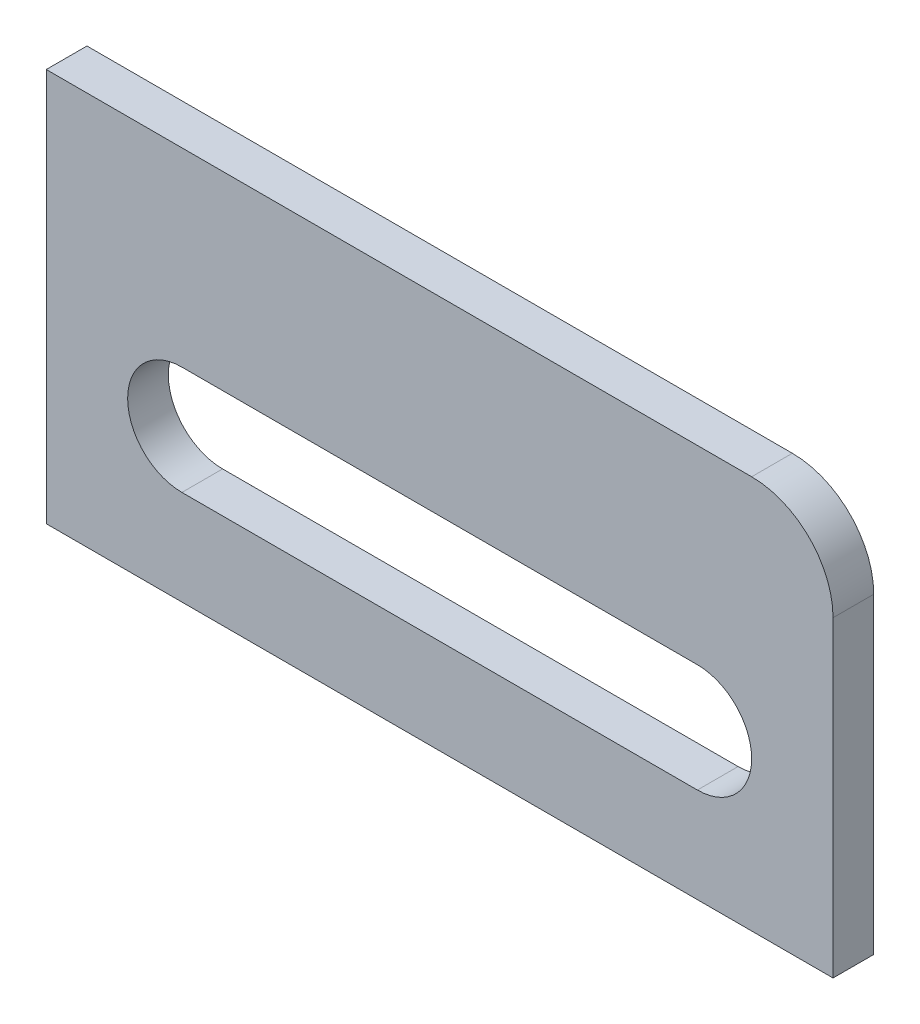
ISO-10303-21;
HEADER;
FILE_DESCRIPTION(('STEP AP214'),'2;1');
FILE_NAME('part.step','',(''),(''),'','','');
FILE_SCHEMA(('AUTOMOTIVE_DESIGN { 1 0 10303 214 1 1 1 1 }'));
ENDSEC;
DATA;
#1=APPLICATION_CONTEXT('core data for automotive mechanical design processes');
#2=APPLICATION_PROTOCOL_DEFINITION('international standard','automotive_design',2000,#1);
#3=PRODUCT_CONTEXT('',#1,'mechanical');
#4=PRODUCT('Part','Part','',(#3));
#5=PRODUCT_RELATED_PRODUCT_CATEGORY('part','',(#4));
#6=PRODUCT_DEFINITION_FORMATION('','',#4);
#7=PRODUCT_DEFINITION_CONTEXT('part definition',#1,'design');
#8=PRODUCT_DEFINITION('design','',#6,#7);
#9=PRODUCT_DEFINITION_SHAPE('','',#8);
#10=(LENGTH_UNIT() NAMED_UNIT(*) SI_UNIT(.MILLI.,.METRE.));
#11=(NAMED_UNIT(*) PLANE_ANGLE_UNIT() SI_UNIT($,.RADIAN.));
#12=(NAMED_UNIT(*) SI_UNIT($,.STERADIAN.) SOLID_ANGLE_UNIT());
#13=UNCERTAINTY_MEASURE_WITH_UNIT(LENGTH_MEASURE(1.E-05),#10,'distance_accuracy_value','');
#14=(GEOMETRIC_REPRESENTATION_CONTEXT(3) GLOBAL_UNCERTAINTY_ASSIGNED_CONTEXT((#13)) GLOBAL_UNIT_ASSIGNED_CONTEXT((#10,
#11,#12)) REPRESENTATION_CONTEXT('',''));
#15=CARTESIAN_POINT('',(0.,0.,0.));
#16=DIRECTION('',(0.,0.,1.));
#17=DIRECTION('',(1.,0.,0.));
#18=AXIS2_PLACEMENT_3D('',#15,#16,#17);
#19=CARTESIAN_POINT('',(0.,0.,3.));
#20=DIRECTION('',(0.,1.,0.));
#21=DIRECTION('',(0.,0.,1.));
#22=AXIS2_PLACEMENT_3D('',#19,#20,#21);
#23=PLANE('',#22);
#24=DIRECTION('',(1.,0.,0.));
#25=VECTOR('',#24,1.);
#26=CARTESIAN_POINT('',(0.,0.,0.));
#27=LINE('',#26,#25);
#28=CARTESIAN_POINT('',(0.,0.,0.));
#29=VERTEX_POINT('',#28);
#30=CARTESIAN_POINT('',(58.,0.,0.));
#31=VERTEX_POINT('',#30);
#32=EDGE_CURVE('E129',#29,#31,#27,.T.);
#33=ORIENTED_EDGE('',*,*,#32,.T.);
#34=DIRECTION('',(0.,0.,-1.));
#35=VECTOR('',#34,1.);
#36=CARTESIAN_POINT('',(58.,0.,3.));
#37=LINE('',#36,#35);
#38=CARTESIAN_POINT('',(58.,0.,3.));
#39=VERTEX_POINT('',#38);
#40=EDGE_CURVE('E165',#39,#31,#37,.T.);
#41=ORIENTED_EDGE('',*,*,#40,.F.);
#42=DIRECTION('',(1.,0.,0.));
#43=VECTOR('',#42,1.);
#44=CARTESIAN_POINT('',(0.,0.,3.));
#45=LINE('',#44,#43);
#46=CARTESIAN_POINT('',(0.,0.,3.));
#47=VERTEX_POINT('',#46);
#48=EDGE_CURVE('E132',#47,#39,#45,.T.);
#49=ORIENTED_EDGE('',*,*,#48,.F.);
#50=DIRECTION('',(0.,0.,-1.));
#51=VECTOR('',#50,1.);
#52=CARTESIAN_POINT('',(0.,0.,3.));
#53=LINE('',#52,#51);
#54=EDGE_CURVE('E144',#47,#29,#53,.T.);
#55=ORIENTED_EDGE('',*,*,#54,.T.);
#56=EDGE_LOOP('',(#33,#41,#49,#55));
#57=FACE_BOUND('',#56,.T.);
#58=ADVANCED_FACE('F34',(#57),#23,.F.);
#59=CARTESIAN_POINT('',(58.,0.,3.));
#60=DIRECTION('',(-1.,0.,0.));
#61=DIRECTION('',(0.,-1.,0.));
#62=AXIS2_PLACEMENT_3D('',#59,#60,#61);
#63=PLANE('',#62);
#64=DIRECTION('',(0.,1.,0.));
#65=VECTOR('',#64,1.);
#66=CARTESIAN_POINT('',(58.,0.,0.));
#67=LINE('',#66,#65);
#68=CARTESIAN_POINT('',(58.,23.,0.));
#69=VERTEX_POINT('',#68);
#70=EDGE_CURVE('E147',#31,#69,#67,.T.);
#71=ORIENTED_EDGE('',*,*,#70,.T.);
#72=DIRECTION('',(0.,0.,-1.));
#73=VECTOR('',#72,1.);
#74=CARTESIAN_POINT('',(58.,23.,3.));
#75=LINE('',#74,#73);
#76=CARTESIAN_POINT('',(58.,23.,3.));
#77=VERTEX_POINT('',#76);
#78=EDGE_CURVE('E162',#77,#69,#75,.T.);
#79=ORIENTED_EDGE('',*,*,#78,.F.);
#80=DIRECTION('',(0.,1.,0.));
#81=VECTOR('',#80,1.);
#82=CARTESIAN_POINT('',(58.,0.,3.));
#83=LINE('',#82,#81);
#84=EDGE_CURVE('E135',#39,#77,#83,.T.);
#85=ORIENTED_EDGE('',*,*,#84,.F.);
#86=ORIENTED_EDGE('',*,*,#40,.T.);
#87=EDGE_LOOP('',(#71,#79,#85,#86));
#88=FACE_BOUND('',#87,.T.);
#89=ADVANCED_FACE('F190',(#88),#63,.F.);
#90=CARTESIAN_POINT('',(52.,23.,3.));
#91=DIRECTION('',(0.,0.,-1.));
#92=DIRECTION('',(-1.,0.,0.));
#93=AXIS2_PLACEMENT_3D('',#90,#91,#92);
#94=CYLINDRICAL_SURFACE('',#93,6.);
#95=CARTESIAN_POINT('',(52.,23.,0.));
#96=DIRECTION('',(0.,0.,1.));
#97=DIRECTION('',(-1.,0.,0.));
#98=AXIS2_PLACEMENT_3D('',#95,#96,#97);
#99=CIRCLE('',#98,6.);
#100=CARTESIAN_POINT('',(51.9999999999999,29.,0.));
#101=VERTEX_POINT('',#100);
#102=EDGE_CURVE('E149',#69,#101,#99,.T.);
#103=ORIENTED_EDGE('',*,*,#102,.T.);
#104=DIRECTION('',(0.,0.,-1.));
#105=VECTOR('',#104,1.);
#106=CARTESIAN_POINT('',(51.9999999999999,29.,3.));
#107=LINE('',#106,#105);
#108=CARTESIAN_POINT('',(51.9999999999999,29.,3.));
#109=VERTEX_POINT('',#108);
#110=EDGE_CURVE('E159',#109,#101,#107,.T.);
#111=ORIENTED_EDGE('',*,*,#110,.F.);
#112=CARTESIAN_POINT('',(52.,23.,3.));
#113=DIRECTION('',(0.,0.,1.));
#114=DIRECTION('',(-1.,0.,0.));
#115=AXIS2_PLACEMENT_3D('',#112,#113,#114);
#116=CIRCLE('',#115,6.);
#117=EDGE_CURVE('E138',#77,#109,#116,.T.);
#118=ORIENTED_EDGE('',*,*,#117,.F.);
#119=ORIENTED_EDGE('',*,*,#78,.T.);
#120=EDGE_LOOP('',(#103,#111,#118,#119));
#121=FACE_BOUND('',#120,.T.);
#122=ADVANCED_FACE('F195',(#121),#94,.T.);
#123=CARTESIAN_POINT('',(0.,29.,3.));
#124=DIRECTION('',(0.,-1.,0.));
#125=DIRECTION('',(0.,0.,-1.));
#126=AXIS2_PLACEMENT_3D('',#123,#124,#125);
#127=PLANE('',#126);
#128=DIRECTION('',(-1.,0.,0.));
#129=VECTOR('',#128,1.);
#130=CARTESIAN_POINT('',(0.,29.,0.));
#131=LINE('',#130,#129);
#132=CARTESIAN_POINT('',(0.,29.,0.));
#133=VERTEX_POINT('',#132);
#134=EDGE_CURVE('E151',#101,#133,#131,.T.);
#135=ORIENTED_EDGE('',*,*,#134,.T.);
#136=DIRECTION('',(0.,0.,-1.));
#137=VECTOR('',#136,1.);
#138=CARTESIAN_POINT('',(0.,29.,3.));
#139=LINE('',#138,#137);
#140=CARTESIAN_POINT('',(0.,29.,3.));
#141=VERTEX_POINT('',#140);
#142=EDGE_CURVE('E156',#141,#133,#139,.T.);
#143=ORIENTED_EDGE('',*,*,#142,.F.);
#144=DIRECTION('',(-1.,0.,0.));
#145=VECTOR('',#144,1.);
#146=CARTESIAN_POINT('',(0.,29.,3.));
#147=LINE('',#146,#145);
#148=EDGE_CURVE('E140',#109,#141,#147,.T.);
#149=ORIENTED_EDGE('',*,*,#148,.F.);
#150=ORIENTED_EDGE('',*,*,#110,.T.);
#151=EDGE_LOOP('',(#135,#143,#149,#150));
#152=FACE_BOUND('',#151,.T.);
#153=ADVANCED_FACE('F212',(#152),#127,.F.);
#154=CARTESIAN_POINT('',(0.,29.,3.));
#155=DIRECTION('',(1.,0.,0.));
#156=DIRECTION('',(0.,0.,-1.));
#157=AXIS2_PLACEMENT_3D('',#154,#155,#156);
#158=PLANE('',#157);
#159=DIRECTION('',(0.,-1.,0.));
#160=VECTOR('',#159,1.);
#161=CARTESIAN_POINT('',(0.,29.,0.));
#162=LINE('',#161,#160);
#163=EDGE_CURVE('E136',#133,#29,#162,.T.);
#164=ORIENTED_EDGE('',*,*,#163,.T.);
#165=ORIENTED_EDGE('',*,*,#54,.F.);
#166=DIRECTION('',(0.,-1.,0.));
#167=VECTOR('',#166,1.);
#168=CARTESIAN_POINT('',(0.,29.,3.));
#169=LINE('',#168,#167);
#170=EDGE_CURVE('E142',#141,#47,#169,.T.);
#171=ORIENTED_EDGE('',*,*,#170,.F.);
#172=ORIENTED_EDGE('',*,*,#142,.T.);
#173=EDGE_LOOP('',(#164,#165,#171,#172));
#174=FACE_BOUND('',#173,.T.);
#175=ADVANCED_FACE('F210',(#174),#158,.F.);
#176=CARTESIAN_POINT('',(52.,23.,3.));
#177=DIRECTION('',(0.,0.,-1.));
#178=DIRECTION('',(-1.,0.,0.));
#179=AXIS2_PLACEMENT_3D('',#176,#177,#178);
#180=PLANE('',#179);
#181=DIRECTION('',(1.,0.,0.));
#182=VECTOR('',#181,1.);
#183=CARTESIAN_POINT('',(10.,7.,3.));
#184=LINE('',#183,#182);
#185=CARTESIAN_POINT('',(10.,7.,3.));
#186=VERTEX_POINT('',#185);
#187=CARTESIAN_POINT('',(48.,7.,3.));
#188=VERTEX_POINT('',#187);
#189=EDGE_CURVE('E115',#186,#188,#184,.T.);
#190=ORIENTED_EDGE('',*,*,#189,.F.);
#191=CARTESIAN_POINT('',(10.,11.,3.));
#192=DIRECTION('',(0.,0.,1.));
#193=DIRECTION('',(1.,0.,0.));
#194=AXIS2_PLACEMENT_3D('',#191,#192,#193);
#195=CIRCLE('',#194,4.);
#196=CARTESIAN_POINT('',(10.,15.,3.));
#197=VERTEX_POINT('',#196);
#198=EDGE_CURVE('E48',#197,#186,#195,.T.);
#199=ORIENTED_EDGE('',*,*,#198,.F.);
#200=DIRECTION('',(-1.,0.,0.));
#201=VECTOR('',#200,1.);
#202=CARTESIAN_POINT('',(10.,15.,3.));
#203=LINE('',#202,#201);
#204=CARTESIAN_POINT('',(48.,15.,3.));
#205=VERTEX_POINT('',#204);
#206=EDGE_CURVE('E122',#205,#197,#203,.T.);
#207=ORIENTED_EDGE('',*,*,#206,.F.);
#208=CARTESIAN_POINT('',(48.,11.,3.));
#209=DIRECTION('',(0.,0.,1.));
#210=DIRECTION('',(1.,0.,0.));
#211=AXIS2_PLACEMENT_3D('',#208,#209,#210);
#212=CIRCLE('',#211,4.);
#213=EDGE_CURVE('E106',#188,#205,#212,.T.);
#214=ORIENTED_EDGE('',*,*,#213,.F.);
#215=EDGE_LOOP('',(#190,#199,#207,#214));
#216=FACE_BOUND('',#215,.T.);
#217=ORIENTED_EDGE('',*,*,#48,.T.);
#218=ORIENTED_EDGE('',*,*,#84,.T.);
#219=ORIENTED_EDGE('',*,*,#117,.T.);
#220=ORIENTED_EDGE('',*,*,#148,.T.);
#221=ORIENTED_EDGE('',*,*,#170,.T.);
#222=EDGE_LOOP('',(#217,#218,#219,#220,#221));
#223=FACE_BOUND('',#222,.T.);
#224=ADVANCED_FACE('F119',(#216,#223),#180,.F.);
#225=CARTESIAN_POINT('',(52.,23.,0.));
#226=DIRECTION('',(0.,0.,-1.));
#227=DIRECTION('',(-1.,0.,0.));
#228=AXIS2_PLACEMENT_3D('',#225,#226,#227);
#229=PLANE('',#228);
#230=CARTESIAN_POINT('',(10.,11.,0.));
#231=DIRECTION('',(0.,0.,-1.));
#232=DIRECTION('',(-1.,0.,0.));
#233=AXIS2_PLACEMENT_3D('',#230,#231,#232);
#234=CIRCLE('',#233,4.);
#235=CARTESIAN_POINT('',(10.,7.,0.));
#236=VERTEX_POINT('',#235);
#237=CARTESIAN_POINT('',(10.,15.,0.));
#238=VERTEX_POINT('',#237);
#239=EDGE_CURVE('E11',#236,#238,#234,.T.);
#240=ORIENTED_EDGE('',*,*,#239,.F.);
#241=DIRECTION('',(-1.,0.,0.));
#242=VECTOR('',#241,1.);
#243=CARTESIAN_POINT('',(52.,7.,0.));
#244=LINE('',#243,#242);
#245=CARTESIAN_POINT('',(48.,7.,0.));
#246=VERTEX_POINT('',#245);
#247=EDGE_CURVE('E168',#246,#236,#244,.T.);
#248=ORIENTED_EDGE('',*,*,#247,.F.);
#249=CARTESIAN_POINT('',(48.,11.,0.));
#250=DIRECTION('',(0.,0.,-1.));
#251=DIRECTION('',(-1.,0.,0.));
#252=AXIS2_PLACEMENT_3D('',#249,#250,#251);
#253=CIRCLE('',#252,4.);
#254=CARTESIAN_POINT('',(48.,15.,0.));
#255=VERTEX_POINT('',#254);
#256=EDGE_CURVE('E109',#255,#246,#253,.T.);
#257=ORIENTED_EDGE('',*,*,#256,.F.);
#258=DIRECTION('',(1.,0.,0.));
#259=VECTOR('',#258,1.);
#260=CARTESIAN_POINT('',(52.,15.,0.));
#261=LINE('',#260,#259);
#262=EDGE_CURVE('E41',#238,#255,#261,.T.);
#263=ORIENTED_EDGE('',*,*,#262,.F.);
#264=EDGE_LOOP('',(#240,#248,#257,#263));
#265=FACE_BOUND('',#264,.T.);
#266=ORIENTED_EDGE('',*,*,#32,.F.);
#267=ORIENTED_EDGE('',*,*,#163,.F.);
#268=ORIENTED_EDGE('',*,*,#134,.F.);
#269=ORIENTED_EDGE('',*,*,#102,.F.);
#270=ORIENTED_EDGE('',*,*,#70,.F.);
#271=EDGE_LOOP('',(#266,#267,#268,#269,#270));
#272=FACE_BOUND('',#271,.T.);
#273=ADVANCED_FACE('F176',(#265,#272),#229,.T.);
#274=CARTESIAN_POINT('',(10.,11.,-7.));
#275=DIRECTION('',(0.,0.,1.));
#276=DIRECTION('',(1.,0.,0.));
#277=AXIS2_PLACEMENT_3D('',#274,#275,#276);
#278=CYLINDRICAL_SURFACE('',#277,4.);
#279=ORIENTED_EDGE('',*,*,#239,.T.);
#280=DIRECTION('',(0.,0.,1.));
#281=VECTOR('',#280,1.);
#282=CARTESIAN_POINT('',(10.,15.,-7.));
#283=LINE('',#282,#281);
#284=EDGE_CURVE('E127',#238,#197,#283,.T.);
#285=ORIENTED_EDGE('',*,*,#284,.T.);
#286=ORIENTED_EDGE('',*,*,#198,.T.);
#287=DIRECTION('',(0.,0.,1.));
#288=VECTOR('',#287,1.);
#289=CARTESIAN_POINT('',(10.,7.,-7.));
#290=LINE('',#289,#288);
#291=EDGE_CURVE('E112',#236,#186,#290,.T.);
#292=ORIENTED_EDGE('',*,*,#291,.F.);
#293=EDGE_LOOP('',(#279,#285,#286,#292));
#294=FACE_BOUND('',#293,.T.);
#295=ADVANCED_FACE('F178',(#294),#278,.F.);
#296=CARTESIAN_POINT('',(10.,15.,-7.));
#297=DIRECTION('',(0.,1.,0.));
#298=DIRECTION('',(0.,0.,1.));
#299=AXIS2_PLACEMENT_3D('',#296,#297,#298);
#300=PLANE('',#299);
#301=ORIENTED_EDGE('',*,*,#262,.T.);
#302=DIRECTION('',(0.,0.,1.));
#303=VECTOR('',#302,1.);
#304=CARTESIAN_POINT('',(48.,15.,-7.));
#305=LINE('',#304,#303);
#306=EDGE_CURVE('E111',#255,#205,#305,.T.);
#307=ORIENTED_EDGE('',*,*,#306,.T.);
#308=ORIENTED_EDGE('',*,*,#206,.T.);
#309=ORIENTED_EDGE('',*,*,#284,.F.);
#310=EDGE_LOOP('',(#301,#307,#308,#309));
#311=FACE_BOUND('',#310,.T.);
#312=ADVANCED_FACE('F173',(#311),#300,.F.);
#313=CARTESIAN_POINT('',(48.,11.,-7.));
#314=DIRECTION('',(0.,0.,1.));
#315=DIRECTION('',(1.,0.,0.));
#316=AXIS2_PLACEMENT_3D('',#313,#314,#315);
#317=CYLINDRICAL_SURFACE('',#316,4.);
#318=ORIENTED_EDGE('',*,*,#256,.T.);
#319=DIRECTION('',(0.,0.,1.));
#320=VECTOR('',#319,1.);
#321=CARTESIAN_POINT('',(48.,7.,-7.));
#322=LINE('',#321,#320);
#323=EDGE_CURVE('E56',#246,#188,#322,.T.);
#324=ORIENTED_EDGE('',*,*,#323,.T.);
#325=ORIENTED_EDGE('',*,*,#213,.T.);
#326=ORIENTED_EDGE('',*,*,#306,.F.);
#327=EDGE_LOOP('',(#318,#324,#325,#326));
#328=FACE_BOUND('',#327,.T.);
#329=ADVANCED_FACE('F103',(#328),#317,.F.);
#330=CARTESIAN_POINT('',(10.,7.,-7.));
#331=DIRECTION('',(0.,-1.,0.));
#332=DIRECTION('',(0.,0.,-1.));
#333=AXIS2_PLACEMENT_3D('',#330,#331,#332);
#334=PLANE('',#333);
#335=ORIENTED_EDGE('',*,*,#247,.T.);
#336=ORIENTED_EDGE('',*,*,#291,.T.);
#337=ORIENTED_EDGE('',*,*,#189,.T.);
#338=ORIENTED_EDGE('',*,*,#323,.F.);
#339=EDGE_LOOP('',(#335,#336,#337,#338));
#340=FACE_BOUND('',#339,.T.);
#341=ADVANCED_FACE('F116',(#340),#334,.F.);
#342=CLOSED_SHELL('',(#58,#89,#122,#153,#175,#224,#273,#295,#312,#329,#341));
#343=MANIFOLD_SOLID_BREP('B2',#342);
#344=ADVANCED_BREP_SHAPE_REPRESENTATION('',(#18,#343),#14);
#345=SHAPE_DEFINITION_REPRESENTATION(#9,#344);
ENDSEC;
END-ISO-10303-21;
